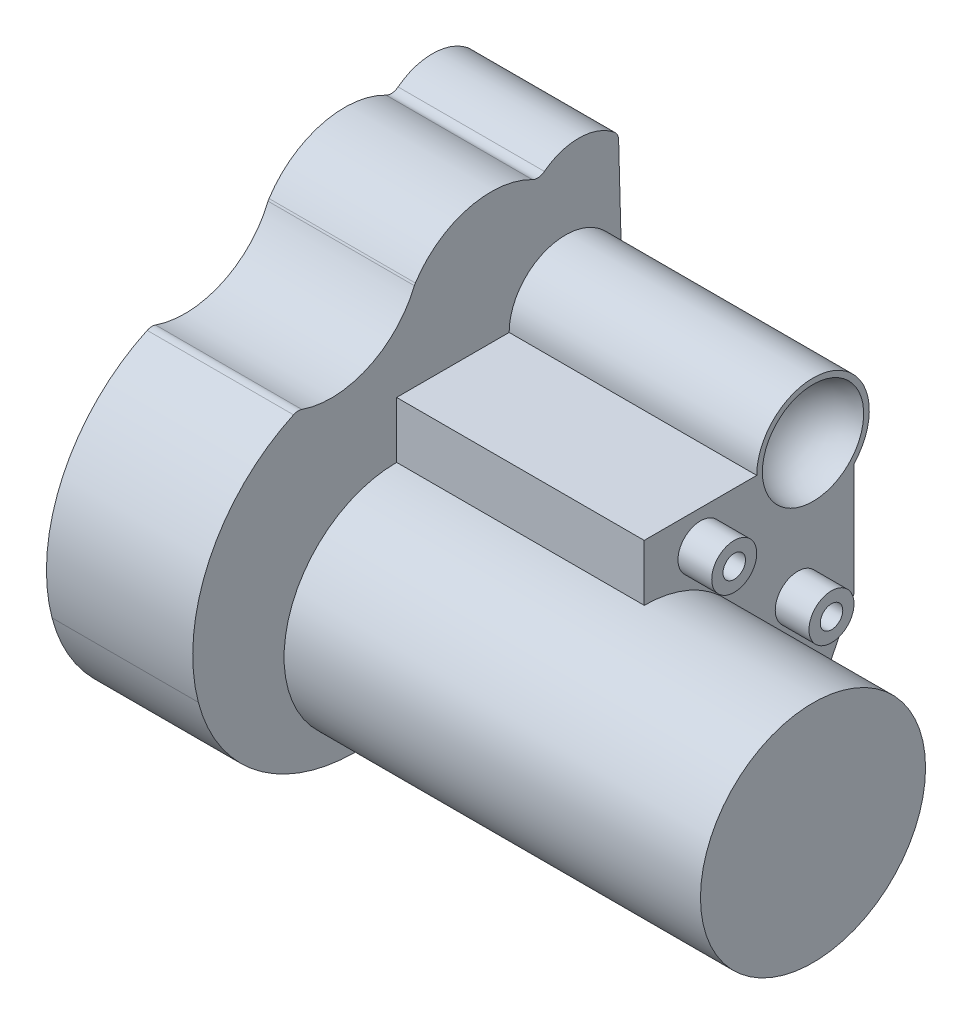
ISO-10303-21;
HEADER;
FILE_DESCRIPTION(('STEP AP214'),'2;1');
FILE_NAME('part.step','',(''),(''),'','','');
FILE_SCHEMA(('AUTOMOTIVE_DESIGN { 1 0 10303 214 1 1 1 1 }'));
ENDSEC;
DATA;
#1=APPLICATION_CONTEXT('core data for automotive mechanical design processes');
#2=APPLICATION_PROTOCOL_DEFINITION('international standard','automotive_design',2000,#1);
#3=PRODUCT_CONTEXT('',#1,'mechanical');
#4=PRODUCT('Part','Part','',(#3));
#5=PRODUCT_RELATED_PRODUCT_CATEGORY('part','',(#4));
#6=PRODUCT_DEFINITION_FORMATION('','',#4);
#7=PRODUCT_DEFINITION_CONTEXT('part definition',#1,'design');
#8=PRODUCT_DEFINITION('design','',#6,#7);
#9=PRODUCT_DEFINITION_SHAPE('','',#8);
#10=(LENGTH_UNIT() NAMED_UNIT(*) SI_UNIT(.MILLI.,.METRE.));
#11=(NAMED_UNIT(*) PLANE_ANGLE_UNIT() SI_UNIT($,.RADIAN.));
#12=(NAMED_UNIT(*) SI_UNIT($,.STERADIAN.) SOLID_ANGLE_UNIT());
#13=UNCERTAINTY_MEASURE_WITH_UNIT(LENGTH_MEASURE(1.E-05),#10,'distance_accuracy_value','');
#14=(GEOMETRIC_REPRESENTATION_CONTEXT(3) GLOBAL_UNCERTAINTY_ASSIGNED_CONTEXT((#13)) GLOBAL_UNIT_ASSIGNED_CONTEXT((#10,
#11,#12)) REPRESENTATION_CONTEXT('',''));
#15=CARTESIAN_POINT('',(0.,0.,0.));
#16=DIRECTION('',(0.,0.,1.));
#17=DIRECTION('',(1.,0.,0.));
#18=AXIS2_PLACEMENT_3D('',#15,#16,#17);
#19=CARTESIAN_POINT('',(-50.,0.,0.));
#20=DIRECTION('',(1.,0.,0.));
#21=DIRECTION('',(0.,0.,-1.));
#22=AXIS2_PLACEMENT_3D('',#19,#20,#21);
#23=CYLINDRICAL_SURFACE('',#22,10.);
#24=CARTESIAN_POINT('',(0.,0.,0.));
#25=DIRECTION('',(1.,0.,0.));
#26=DIRECTION('',(0.,0.,-1.));
#27=AXIS2_PLACEMENT_3D('',#24,#25,#26);
#28=CIRCLE('',#27,10.);
#29=CARTESIAN_POINT('',(0.,0.,-10.));
#30=VERTEX_POINT('',#29);
#31=EDGE_CURVE('E315',#30,#30,#28,.T.);
#32=ORIENTED_EDGE('',*,*,#31,.F.);
#33=EDGE_LOOP('',(#32));
#34=FACE_BOUND('',#33,.T.);
#35=DIRECTION('',(1.,0.,0.));
#36=VECTOR('',#35,1.);
#37=CARTESIAN_POINT('',(-50.,10.,0.));
#38=LINE('',#37,#36);
#39=CARTESIAN_POINT('',(-15.,10.,0.));
#40=VERTEX_POINT('',#39);
#41=CARTESIAN_POINT('',(-37.,10.,0.));
#42=VERTEX_POINT('',#41);
#43=EDGE_CURVE('E319',#40,#42,#38,.F.);
#44=ORIENTED_EDGE('',*,*,#43,.T.);
#45=CARTESIAN_POINT('',(-37.,0.,0.));
#46=DIRECTION('',(-1.,0.,0.));
#47=DIRECTION('',(0.,0.,1.));
#48=AXIS2_PLACEMENT_3D('',#45,#46,#47);
#49=CIRCLE('',#48,10.);
#50=CARTESIAN_POINT('',(-37.,-10.,0.));
#51=VERTEX_POINT('',#50);
#52=EDGE_CURVE('E320',#51,#42,#49,.T.);
#53=ORIENTED_EDGE('',*,*,#52,.F.);
#54=DIRECTION('',(-1.,0.,0.));
#55=VECTOR('',#54,1.);
#56=CARTESIAN_POINT('',(-15.,-10.,0.));
#57=LINE('',#56,#55);
#58=CARTESIAN_POINT('',(-15.,-10.,0.));
#59=VERTEX_POINT('',#58);
#60=EDGE_CURVE('E326',#59,#51,#57,.T.);
#61=ORIENTED_EDGE('',*,*,#60,.F.);
#62=CARTESIAN_POINT('',(-15.,0.,0.));
#63=DIRECTION('',(-1.,0.,0.));
#64=DIRECTION('',(0.,0.,1.));
#65=AXIS2_PLACEMENT_3D('',#62,#63,#64);
#66=CIRCLE('',#65,10.);
#67=CARTESIAN_POINT('',(-15.,-4.7586438353542,-8.79518668637827));
#68=VERTEX_POINT('',#67);
#69=EDGE_CURVE('E335',#59,#68,#66,.F.);
#70=ORIENTED_EDGE('',*,*,#69,.T.);
#71=CARTESIAN_POINT('',(-15.,-4.75864383535178,-8.7951866863726));
#72=CARTESIAN_POINT('',(-14.9558268940209,-4.75864350656766,-8.79518708404648));
#73=CARTESIAN_POINT('',(-14.9116356564466,-4.75574612101029,-8.79675641023494));
#74=CARTESIAN_POINT('',(-14.8241661556282,-4.74410731339931,-8.80303860906836));
#75=CARTESIAN_POINT('',(-14.7808898730519,-4.73535433295313,-8.80775769900793));
#76=CARTESIAN_POINT('',(-14.6962913195909,-4.7118618208952,-8.82034789827312));
#77=CARTESIAN_POINT('',(-14.6549760223784,-4.69710248569725,-8.82822943329732));
#78=CARTESIAN_POINT('',(-14.575829635857,-4.66150214040771,-8.84707875225866));
#79=CARTESIAN_POINT('',(-14.5379934462864,-4.64067022571927,-8.85804191970975));
#80=CARTESIAN_POINT('',(-14.4748449094057,-4.59796230305127,-8.88026978976679));
#81=CARTESIAN_POINT('',(-14.4485709297719,-4.57722365601009,-8.89098798790657));
#82=CARTESIAN_POINT('',(-14.4001803158164,-4.53209501619798,-8.91407627284621));
#83=CARTESIAN_POINT('',(-14.3780623653748,-4.50770618376786,-8.92644583456714));
#84=CARTESIAN_POINT('',(-14.3389186743536,-4.45543285745039,-8.9526519767399));
#85=CARTESIAN_POINT('',(-14.321934646245,-4.42752221072471,-8.96649939886511));
#86=CARTESIAN_POINT('',(-14.2944182546674,-4.36910362228332,-8.99510893589732));
#87=CARTESIAN_POINT('',(-14.283879155866,-4.3385984301413,-9.00987007807992));
#88=CARTESIAN_POINT('',(-14.2710107631572,-4.28043975672838,-9.03762844130118));
#89=CARTESIAN_POINT('',(-14.2677500741415,-4.25297278710381,-9.0505883427895));
#90=CARTESIAN_POINT('',(-14.2668241687123,-4.1978481855485,-9.07628741918052));
#91=CARTESIAN_POINT('',(-14.2691563984039,-4.17019064638831,-9.08902669215318));
#92=CARTESIAN_POINT('',(-14.2788772815525,-4.11766166420888,-9.11293772746178));
#93=CARTESIAN_POINT('',(-14.2858735506432,-4.09273684615446,-9.12415539253821));
#94=CARTESIAN_POINT('',(-14.3041488513327,-4.0441524856089,-9.14579348541309));
#95=CARTESIAN_POINT('',(-14.3154282772818,-4.02049305985134,-9.15621383969697));
#96=CARTESIAN_POINT('',(-14.3423829805957,-3.97386814038485,-9.17654892193133));
#97=CARTESIAN_POINT('',(-14.3582407440293,-3.95098822454152,-9.18641651100526));
#98=CARTESIAN_POINT('',(-14.3934426115413,-3.90756164416255,-9.20497261440431));
#99=CARTESIAN_POINT('',(-14.4127881687952,-3.88701595801308,-9.21366063461167));
#100=CARTESIAN_POINT('',(-14.4571284792549,-3.84590517201177,-9.23090330492731));
#101=CARTESIAN_POINT('',(-14.4825331266788,-3.82570967606245,-9.23928260677338));
#102=CARTESIAN_POINT('',(-14.536176175821,-3.78880699300985,-9.25447677029559));
#103=CARTESIAN_POINT('',(-14.5644161997748,-3.77210181989673,-9.26129072895995));
#104=CARTESIAN_POINT('',(-14.6281442374839,-3.7396323447794,-9.27445469092177));
#105=CARTESIAN_POINT('',(-14.6640361797884,-3.72454330873218,-9.28051523687644));
#106=CARTESIAN_POINT('',(-14.7377737692172,-3.6992753912817,-9.29061601322216));
#107=CARTESIAN_POINT('',(-14.7756205294798,-3.68909934239279,-9.29465507820552));
#108=CARTESIAN_POINT('',(-14.8586402252632,-3.67238593203854,-9.30127289164795));
#109=CARTESIAN_POINT('',(-14.9040125120501,-3.6666969434864,-9.30351232326005));
#110=CARTESIAN_POINT('',(-14.9951804405428,-3.66186683918907,-9.30541437558098));
#111=CARTESIAN_POINT('',(-15.0409763976911,-3.66273107398423,-9.30507489066957));
#112=CARTESIAN_POINT('',(-15.1357980012852,-3.67137999491661,-9.30166623605312));
#113=CARTESIAN_POINT('',(-15.1847635618646,-3.67975218115553,-9.29836532401767));
#114=CARTESIAN_POINT('',(-15.280379034205,-3.70430232339992,-9.2886123505109));
#115=CARTESIAN_POINT('',(-15.3270305476835,-3.72047479471608,-9.2821625031418));
#116=CARTESIAN_POINT('',(-15.4069809196085,-3.75647877288219,-9.26764038923529));
#117=CARTESIAN_POINT('',(-15.4410454654374,-3.77486102975262,-9.26017985845415));
#118=CARTESIAN_POINT('',(-15.5054704281055,-3.81647601332857,-9.2431063875105));
#119=CARTESIAN_POINT('',(-15.5358355636836,-3.83970245626696,-9.23349623462915));
#120=CARTESIAN_POINT('',(-15.5870119736839,-3.8865897942095,-9.21384582286242));
#121=CARTESIAN_POINT('',(-15.608573881303,-3.90956576791005,-9.20412966922469));
#122=CARTESIAN_POINT('',(-15.6472971721671,-3.95840621722519,-9.18323057748568));
#123=CARTESIAN_POINT('',(-15.6644599810526,-3.98426975314075,-9.17204811635916));
#124=CARTESIAN_POINT('',(-15.6935764129903,-4.03848446014547,-9.14830708879385));
#125=CARTESIAN_POINT('',(-15.7054952125867,-4.06685080256862,-9.13573999609742));
#126=CARTESIAN_POINT('',(-15.7231643904435,-4.12501836443434,-9.10962323839953));
#127=CARTESIAN_POINT('',(-15.7289192784182,-4.15481851815163,-9.09607429950759));
#128=CARTESIAN_POINT('',(-15.7335602290888,-4.21121119657511,-9.07009098263221));
#129=CARTESIAN_POINT('',(-15.7331707925429,-4.23777133386224,-9.05771153360055));
#130=CARTESIAN_POINT('',(-15.7272928288401,-4.29031004444083,-9.03294428661083));
#131=CARTESIAN_POINT('',(-15.7218053513422,-4.31628873632118,-9.02055649089595));
#132=CARTESIAN_POINT('',(-15.706316699102,-4.36606995700641,-8.99656448567632));
#133=CARTESIAN_POINT('',(-15.6964733320716,-4.38991627178298,-8.98494793252488));
#134=CARTESIAN_POINT('',(-15.672799286317,-4.4358591608867,-8.96235515213759));
#135=CARTESIAN_POINT('',(-15.6589677173642,-4.45795534315183,-8.95137906852293));
#136=CARTESIAN_POINT('',(-15.6266295723265,-4.50172737990007,-8.9294511470181));
#137=CARTESIAN_POINT('',(-15.607836991965,-4.52322734582993,-8.91857187688621));
#138=CARTESIAN_POINT('',(-15.5669731276429,-4.56350569021496,-8.89802944695476));
#139=CARTESIAN_POINT('',(-15.5449005043056,-4.58228295065948,-8.88836678693882));
#140=CARTESIAN_POINT('',(-15.4945665573651,-4.61964642111244,-8.869012102499));
#141=CARTESIAN_POINT('',(-15.465874846108,-4.63776612750009,-8.85954065238327));
#142=CARTESIAN_POINT('',(-15.4058852401428,-4.67019349561687,-8.84248995585931));
#143=CARTESIAN_POINT('',(-15.3745848691928,-4.68449747995594,-8.83491253525574));
#144=CARTESIAN_POINT('',(-15.3044029603204,-4.71151710192947,-8.8205375213445));
#145=CARTESIAN_POINT('',(-15.2651619881536,-4.72350001930202,-8.81411714793605));
#146=CARTESIAN_POINT('',(-15.1851742903419,-4.74227658565788,-8.80402898794261));
#147=CARTESIAN_POINT('',(-15.1444291453868,-4.74907552823767,-8.80035839349827));
#148=CARTESIAN_POINT('',(-15.0690606726297,-4.75687349800959,-8.79614508590789));
#149=CARTESIAN_POINT('',(-15.0345358778634,-4.7586440924052,-8.79518637545907));
#150=CARTESIAN_POINT('',(-15.,-4.75864383535178,-8.7951866863726));
#151=B_SPLINE_CURVE_WITH_KNOTS('',3,(#71,#72,#73,#74,#75,#76,#77,#78,#79,#80,#81,#82,#83,#84,
#85,#86,#87,#88,#89,#90,#91,#92,#93,#94,#95,#96,#97,#98,#99,#100,#101,#102,#103,#104,#105,#106,
#107,#108,#109,#110,#111,#112,#113,#114,#115,#116,#117,#118,#119,#120,#121,#122,#123,#124,#125,
#126,#127,#128,#129,#130,#131,#132,#133,#134,#135,#136,#137,#138,#139,#140,#141,#142,#143,#144,
#145,#146,#147,#148,#149,#150),.UNSPECIFIED.,.T.,.F.,(4,2,2,2,2,2,2,2,2,2,2,2,2,2,2,2,2,2,2,2,2,
2,2,2,2,2,2,2,2,2,2,2,2,2,2,2,2,2,2,4),(0.,0.132426570558758,0.265115313014988,
0.398245135269075,0.531176573650806,0.636200366249108,0.741190843944197,0.847012745709135,
0.952723867485179,1.04386382677862,1.13496217675032,1.21922758106377,1.30350074557547,
1.39175490891963,1.48004592834338,1.58022071879385,1.68045315355052,1.79821175209846,
1.91603816189304,2.05281367594922,2.18970087575475,2.33833476721941,2.48686430033177,
2.60466464166346,2.72231311504932,2.82082898571128,2.91931288930389,3.01844126367226,
3.11749706291567,3.20497002644944,3.29242498376524,3.37694230818155,3.46147851280326,
3.55279568810177,3.64415025495762,3.74944688259905,3.85484462588068,3.97895242611329,
4.10293332377123,4.2064684446399),.UNSPECIFIED.);
#152=CARTESIAN_POINT('',(-15.,-3.66294903859895,-9.30498814296004));
#153=VERTEX_POINT('',#152);
#154=EDGE_CURVE('E243',#68,#153,#151,.T.);
#155=ORIENTED_EDGE('',*,*,#154,.T.);
#156=EDGE_CURVE('E323',#153,#40,#66,.F.);
#157=ORIENTED_EDGE('',*,*,#156,.T.);
#158=EDGE_LOOP('',(#44,#53,#61,#70,#155,#157));
#159=FACE_BOUND('',#158,.T.);
#160=ADVANCED_FACE('F35',(#34,#159),#23,.T.);
#161=CARTESIAN_POINT('',(-15.,10.,0.));
#162=DIRECTION('',(0.,0.,-1.));
#163=DIRECTION('',(-1.,0.,0.));
#164=AXIS2_PLACEMENT_3D('',#161,#162,#163);
#165=PLANE('',#164);
#166=DIRECTION('',(0.,1.,0.));
#167=VECTOR('',#166,1.);
#168=CARTESIAN_POINT('',(-37.,0.,0.));
#169=LINE('',#168,#167);
#170=CARTESIAN_POINT('',(-37.,15.,0.));
#171=VERTEX_POINT('',#170);
#172=EDGE_CURVE('E409',#42,#171,#169,.T.);
#173=ORIENTED_EDGE('',*,*,#172,.F.);
#174=ORIENTED_EDGE('',*,*,#43,.F.);
#175=DIRECTION('',(0.,1.,0.));
#176=VECTOR('',#175,1.);
#177=CARTESIAN_POINT('',(-15.,10.,0.));
#178=LINE('',#177,#176);
#179=CARTESIAN_POINT('',(-15.,15.,0.));
#180=VERTEX_POINT('',#179);
#181=EDGE_CURVE('E251',#40,#180,#178,.T.);
#182=ORIENTED_EDGE('',*,*,#181,.T.);
#183=DIRECTION('',(-1.,0.,0.));
#184=VECTOR('',#183,1.);
#185=CARTESIAN_POINT('',(-15.,15.,0.));
#186=LINE('',#185,#184);
#187=EDGE_CURVE('E332',#180,#171,#186,.T.);
#188=ORIENTED_EDGE('',*,*,#187,.T.);
#189=EDGE_LOOP('',(#173,#174,#182,#188));
#190=FACE_BOUND('',#189,.T.);
#191=ADVANCED_FACE('F271',(#190),#165,.F.);
#192=CARTESIAN_POINT('',(-15.,15.,-15.));
#193=DIRECTION('',(-1.,0.,0.));
#194=DIRECTION('',(0.,0.,1.));
#195=AXIS2_PLACEMENT_3D('',#192,#193,#194);
#196=CYLINDRICAL_SURFACE('',#195,5.);
#197=CARTESIAN_POINT('',(-50.,15.,-15.));
#198=DIRECTION('',(-1.,0.,0.));
#199=DIRECTION('',(0.,0.,1.));
#200=AXIS2_PLACEMENT_3D('',#197,#198,#199);
#201=CIRCLE('',#200,5.);
#202=CARTESIAN_POINT('',(-50.,15.2742111737005,-19.9924751609014));
#203=VERTEX_POINT('',#202);
#204=CARTESIAN_POINT('',(-50.,11.5749926637884,-18.6427084356144));
#205=VERTEX_POINT('',#204);
#206=EDGE_CURVE('E250',#203,#205,#201,.T.);
#207=ORIENTED_EDGE('',*,*,#206,.F.);
#208=DIRECTION('',(-1.,0.,0.));
#209=VECTOR('',#208,1.);
#210=CARTESIAN_POINT('',(-37.,15.2742111737005,-19.9924751609014));
#211=LINE('',#210,#209);
#212=CARTESIAN_POINT('',(-37.,15.2742111737005,-19.9924751609014));
#213=VERTEX_POINT('',#212);
#214=EDGE_CURVE('E198',#213,#203,#211,.T.);
#215=ORIENTED_EDGE('',*,*,#214,.F.);
#216=CARTESIAN_POINT('',(-37.,15.,-15.));
#217=DIRECTION('',(-1.,0.,0.));
#218=DIRECTION('',(0.,0.,1.));
#219=AXIS2_PLACEMENT_3D('',#216,#217,#218);
#220=CIRCLE('',#219,5.);
#221=CARTESIAN_POINT('',(-37.,15.,-10.));
#222=VERTEX_POINT('',#221);
#223=EDGE_CURVE('E413',#222,#213,#220,.T.);
#224=ORIENTED_EDGE('',*,*,#223,.F.);
#225=DIRECTION('',(-1.,0.,0.));
#226=VECTOR('',#225,1.);
#227=CARTESIAN_POINT('',(-15.,15.,-10.));
#228=LINE('',#227,#226);
#229=CARTESIAN_POINT('',(-15.,15.,-10.));
#230=VERTEX_POINT('',#229);
#231=EDGE_CURVE('E456',#230,#222,#228,.T.);
#232=ORIENTED_EDGE('',*,*,#231,.F.);
#233=CARTESIAN_POINT('',(-15.,15.,-15.));
#234=DIRECTION('',(-1.,0.,0.));
#235=DIRECTION('',(0.,0.,1.));
#236=AXIS2_PLACEMENT_3D('',#233,#234,#235);
#237=CIRCLE('',#236,5.);
#238=CARTESIAN_POINT('',(-15.,11.5749926637884,-18.6427084356144));
#239=VERTEX_POINT('',#238);
#240=EDGE_CURVE('E497',#230,#239,#237,.T.);
#241=ORIENTED_EDGE('',*,*,#240,.T.);
#242=DIRECTION('',(-1.,0.,0.));
#243=VECTOR('',#242,1.);
#244=CARTESIAN_POINT('',(-15.,11.5749926637884,-18.6427084356144));
#245=LINE('',#244,#243);
#246=EDGE_CURVE('E459',#239,#205,#245,.T.);
#247=ORIENTED_EDGE('',*,*,#246,.T.);
#248=EDGE_LOOP('',(#207,#215,#224,#232,#241,#247));
#249=FACE_BOUND('',#248,.T.);
#250=ADVANCED_FACE('F274',(#249),#196,.T.);
#251=CARTESIAN_POINT('',(-15.,15.,0.));
#252=DIRECTION('',(0.,1.,0.));
#253=DIRECTION('',(0.,0.,1.));
#254=AXIS2_PLACEMENT_3D('',#251,#252,#253);
#255=PLANE('',#254);
#256=ORIENTED_EDGE('',*,*,#231,.T.);
#257=DIRECTION('',(0.,0.,-1.));
#258=VECTOR('',#257,1.);
#259=CARTESIAN_POINT('',(-37.,15.,0.));
#260=LINE('',#259,#258);
#261=EDGE_CURVE('E411',#171,#222,#260,.T.);
#262=ORIENTED_EDGE('',*,*,#261,.F.);
#263=ORIENTED_EDGE('',*,*,#187,.F.);
#264=DIRECTION('',(0.,0.,-1.));
#265=VECTOR('',#264,1.);
#266=CARTESIAN_POINT('',(-15.,15.,0.));
#267=LINE('',#266,#265);
#268=EDGE_CURVE('E520',#180,#230,#267,.T.);
#269=ORIENTED_EDGE('',*,*,#268,.T.);
#270=EDGE_LOOP('',(#256,#262,#263,#269));
#271=FACE_BOUND('',#270,.T.);
#272=ADVANCED_FACE('F298',(#271),#255,.T.);
#273=CARTESIAN_POINT('',(-15.,15.,-15.));
#274=DIRECTION('',(-1.,0.,0.));
#275=DIRECTION('',(0.,0.,1.));
#276=AXIS2_PLACEMENT_3D('',#273,#274,#275);
#277=PLANE('',#276);
#278=CARTESIAN_POINT('',(-15.,12.,-5.));
#279=DIRECTION('',(-1.,0.,0.));
#280=DIRECTION('',(0.,0.,1.));
#281=AXIS2_PLACEMENT_3D('',#278,#279,#280);
#282=CIRCLE('',#281,2.);
#283=CARTESIAN_POINT('',(-15.,12.,-3.));
#284=VERTEX_POINT('',#283);
#285=EDGE_CURVE('E346',#284,#284,#282,.F.);
#286=ORIENTED_EDGE('',*,*,#285,.F.);
#287=EDGE_LOOP('',(#286));
#288=FACE_BOUND('',#287,.T.);
#289=CARTESIAN_POINT('',(-15.,3.80169288123777,-13.6427084356144));
#290=DIRECTION('',(-1.,0.,0.));
#291=DIRECTION('',(0.,0.,1.));
#292=AXIS2_PLACEMENT_3D('',#289,#290,#291);
#293=CIRCLE('',#292,2.);
#294=CARTESIAN_POINT('',(-15.,3.80169288123777,-11.6427084356144));
#295=VERTEX_POINT('',#294);
#296=EDGE_CURVE('E343',#295,#295,#293,.F.);
#297=ORIENTED_EDGE('',*,*,#296,.F.);
#298=EDGE_LOOP('',(#297));
#299=FACE_BOUND('',#298,.T.);
#300=CARTESIAN_POINT('',(-15.,15.,-15.));
#301=DIRECTION('',(-1.,0.,0.));
#302=DIRECTION('',(0.,0.,1.));
#303=AXIS2_PLACEMENT_3D('',#300,#301,#302);
#304=CIRCLE('',#303,4.5);
#305=CARTESIAN_POINT('',(-15.,15.,-10.5));
#306=VERTEX_POINT('',#305);
#307=EDGE_CURVE('E239',#306,#306,#304,.T.);
#308=ORIENTED_EDGE('',*,*,#307,.T.);
#309=EDGE_LOOP('',(#308));
#310=FACE_BOUND('',#309,.T.);
#311=CARTESIAN_POINT('',(-15.,-6.19830711876223,-13.321760405032));
#312=DIRECTION('',(-1.,0.,0.));
#313=DIRECTION('',(0.,0.,1.));
#314=AXIS2_PLACEMENT_3D('',#311,#312,#313);
#315=CIRCLE('',#314,4.75);
#316=CARTESIAN_POINT('',(-15.,-2.80216163039296,-16.6427084356144));
#317=VERTEX_POINT('',#316);
#318=EDGE_CURVE('E340',#317,#153,#315,.F.);
#319=ORIENTED_EDGE('',*,*,#318,.F.);
#320=DIRECTION('',(0.,-1.,0.));
#321=VECTOR('',#320,1.);
#322=CARTESIAN_POINT('',(-15.,-2.42500733621165,-16.6427084356144));
#323=LINE('',#322,#321);
#324=CARTESIAN_POINT('',(-15.,-2.42500733621165,-16.6427084356144));
#325=VERTEX_POINT('',#324);
#326=EDGE_CURVE('E466',#325,#317,#323,.T.);
#327=ORIENTED_EDGE('',*,*,#326,.F.);
#328=DIRECTION('',(0.,-0.894427190999916,0.447213595499958));
#329=VECTOR('',#328,1.);
#330=CARTESIAN_POINT('',(-15.,1.57499266378835,-18.6427084356144));
#331=LINE('',#330,#329);
#332=CARTESIAN_POINT('',(-15.,1.57499266378835,-18.6427084356144));
#333=VERTEX_POINT('',#332);
#334=EDGE_CURVE('E505',#333,#325,#331,.T.);
#335=ORIENTED_EDGE('',*,*,#334,.F.);
#336=DIRECTION('',(0.,-1.,0.));
#337=VECTOR('',#336,1.);
#338=CARTESIAN_POINT('',(-15.,11.5749926637884,-18.6427084356144));
#339=LINE('',#338,#337);
#340=EDGE_CURVE('E518',#239,#333,#339,.T.);
#341=ORIENTED_EDGE('',*,*,#340,.F.);
#342=ORIENTED_EDGE('',*,*,#240,.F.);
#343=ORIENTED_EDGE('',*,*,#268,.F.);
#344=ORIENTED_EDGE('',*,*,#181,.F.);
#345=ORIENTED_EDGE('',*,*,#156,.F.);
#346=EDGE_LOOP('',(#319,#327,#335,#341,#342,#343,#344,#345));
#347=FACE_BOUND('',#346,.T.);
#348=ADVANCED_FACE('F270',(#288,#299,#310,#347),#277,.F.);
#349=CARTESIAN_POINT('',(-50.,0.,0.));
#350=DIRECTION('',(1.,0.,0.));
#351=DIRECTION('',(0.,0.,-1.));
#352=AXIS2_PLACEMENT_3D('',#349,#350,#351);
#353=PLANE('',#352);
#354=DIRECTION('',(0.,0.999623687239425,0.027431440171024));
#355=VECTOR('',#354,1.);
#356=CARTESIAN_POINT('',(-50.,0.559709606048781,-20.3962670823536));
#357=LINE('',#356,#355);
#358=CARTESIAN_POINT('',(-50.,24.6233101378481,-19.7359193667943));
#359=VERTEX_POINT('',#358);
#360=CARTESIAN_POINT('',(-50.,24.9757959168408,-19.7262465342264));
#361=VERTEX_POINT('',#360);
#362=EDGE_CURVE('E193',#359,#361,#357,.T.);
#363=ORIENTED_EDGE('',*,*,#362,.F.);
#364=CARTESIAN_POINT('',(-50.,20.1250035452707,-19.8593608475639));
#365=DIRECTION('',(1.,0.,0.));
#366=DIRECTION('',(0.,0.,-1.));
#367=AXIS2_PLACEMENT_3D('',#364,#365,#366);
#368=CIRCLE('',#367,4.5);
#369=CARTESIAN_POINT('',(-50.,15.6266969526933,-19.9828023283335));
#370=VERTEX_POINT('',#369);
#371=EDGE_CURVE('E49',#359,#370,#368,.T.);
#372=ORIENTED_EDGE('',*,*,#371,.T.);
#373=EDGE_CURVE('E190',#203,#370,#357,.T.);
#374=ORIENTED_EDGE('',*,*,#373,.F.);
#375=ORIENTED_EDGE('',*,*,#206,.T.);
#376=DIRECTION('',(0.,-1.,0.));
#377=VECTOR('',#376,1.);
#378=CARTESIAN_POINT('',(-50.,11.5749926637884,-18.6427084356144));
#379=LINE('',#378,#377);
#380=CARTESIAN_POINT('',(-50.,1.57499266378835,-18.6427084356144));
#381=VERTEX_POINT('',#380);
#382=EDGE_CURVE('E471',#205,#381,#379,.T.);
#383=ORIENTED_EDGE('',*,*,#382,.T.);
#384=DIRECTION('',(0.,-0.894427190999916,0.447213595499958));
#385=VECTOR('',#384,1.);
#386=CARTESIAN_POINT('',(-50.,1.57499266378835,-18.6427084356144));
#387=LINE('',#386,#385);
#388=CARTESIAN_POINT('',(-50.,-2.42500733621165,-16.6427084356144));
#389=VERTEX_POINT('',#388);
#390=EDGE_CURVE('E474',#381,#389,#387,.T.);
#391=ORIENTED_EDGE('',*,*,#390,.T.);
#392=DIRECTION('',(0.,-1.,0.));
#393=VECTOR('',#392,1.);
#394=CARTESIAN_POINT('',(-50.,-2.42500733621165,-16.6427084356144));
#395=LINE('',#394,#393);
#396=CARTESIAN_POINT('',(-50.,-9.99775044892711,-16.6427084356144));
#397=VERTEX_POINT('',#396);
#398=EDGE_CURVE('E477',#389,#397,#395,.T.);
#399=ORIENTED_EDGE('',*,*,#398,.T.);
#400=CARTESIAN_POINT('',(-50.,-6.,-13.32));
#401=DIRECTION('',(1.,0.,0.));
#402=DIRECTION('',(0.,0.,-1.));
#403=AXIS2_PLACEMENT_3D('',#400,#401,#402);
#404=CIRCLE('',#403,5.19830741684252);
#405=CARTESIAN_POINT('',(-50.,-10.,-10.));
#406=VERTEX_POINT('',#405);
#407=EDGE_CURVE('E480',#406,#397,#404,.T.);
#408=ORIENTED_EDGE('',*,*,#407,.F.);
#409=DIRECTION('',(0.,0.,-1.));
#410=VECTOR('',#409,1.);
#411=CARTESIAN_POINT('',(-50.,-10.,0.));
#412=LINE('',#411,#410);
#413=CARTESIAN_POINT('',(-50.,-10.,0.));
#414=VERTEX_POINT('',#413);
#415=EDGE_CURVE('E483',#414,#406,#412,.T.);
#416=ORIENTED_EDGE('',*,*,#415,.F.);
#417=CARTESIAN_POINT('',(-50.,3.98195125951587,3.63689802684925));
#418=DIRECTION('',(-1.,0.,0.));
#419=DIRECTION('',(0.,0.,1.));
#420=AXIS2_PLACEMENT_3D('',#417,#418,#419);
#421=CIRCLE('',#420,14.4472138587749);
#422=CARTESIAN_POINT('',(-50.,0.345053232664054,17.6188492863645));
#423=VERTEX_POINT('',#422);
#424=EDGE_CURVE('E199',#414,#423,#421,.T.);
#425=ORIENTED_EDGE('',*,*,#424,.T.);
#426=CARTESIAN_POINT('',(-50.,4.23247986290294,2.67374792040959));
#427=DIRECTION('',(-1.,0.,0.));
#428=DIRECTION('',(0.,0.,1.));
#429=AXIS2_PLACEMENT_3D('',#426,#427,#428);
#430=CIRCLE('',#429,15.4424136923007);
#431=CARTESIAN_POINT('',(-50.,18.2444597450297,9.16470782068875));
#432=VERTEX_POINT('',#431);
#433=EDGE_CURVE('E202',#423,#432,#430,.T.);
#434=ORIENTED_EDGE('',*,*,#433,.T.);
#435=CARTESIAN_POINT('',(-50.,17.3370899412332,8.74437457294553));
#436=DIRECTION('',(1.,0.,0.));
#437=DIRECTION('',(0.,0.,-1.));
#438=AXIS2_PLACEMENT_3D('',#435,#436,#437);
#439=CIRCLE('',#438,1.);
#440=CARTESIAN_POINT('',(-50.,18.28286013423,8.419538087866));
#441=VERTEX_POINT('',#440);
#442=EDGE_CURVE('E354',#432,#441,#439,.F.);
#443=ORIENTED_EDGE('',*,*,#442,.T.);
#444=CARTESIAN_POINT('',(-50.,25.8490216782043,5.82084620722977));
#445=DIRECTION('',(-1.,0.,0.));
#446=DIRECTION('',(0.,0.,1.));
#447=AXIS2_PLACEMENT_3D('',#444,#445,#446);
#448=CIRCLE('',#447,8.);
#449=CARTESIAN_POINT('',(-50.,22.8097131556067,-1.57932971665649));
#450=VERTEX_POINT('',#449);
#451=EDGE_CURVE('E210',#441,#450,#448,.F.);
#452=ORIENTED_EDGE('',*,*,#451,.T.);
#453=CARTESIAN_POINT('',(-50.,22.429799590282,-2.50435170714227));
#454=DIRECTION('',(1.,0.,0.));
#455=DIRECTION('',(0.,0.,-1.));
#456=AXIS2_PLACEMENT_3D('',#453,#454,#455);
#457=CIRCLE('',#456,1.);
#458=CARTESIAN_POINT('',(-50.,22.9727489897229,-1.66458629368042));
#459=VERTEX_POINT('',#458);
#460=EDGE_CURVE('E352',#450,#459,#457,.F.);
#461=ORIENTED_EDGE('',*,*,#460,.T.);
#462=CARTESIAN_POINT('',(-50.,18.6291537941956,-8.38270960137518));
#463=DIRECTION('',(-1.,0.,0.));
#464=DIRECTION('',(0.,0.,1.));
#465=AXIS2_PLACEMENT_3D('',#462,#463,#464);
#466=CIRCLE('',#465,8.);
#467=CARTESIAN_POINT('',(-50.,25.7329790040555,-12.0617947305559));
#468=VERTEX_POINT('',#467);
#469=EDGE_CURVE('E194',#459,#468,#466,.T.);
#470=ORIENTED_EDGE('',*,*,#469,.T.);
#471=CARTESIAN_POINT('',(-50.,26.6209571552879,-12.5216803717035));
#472=DIRECTION('',(1.,0.,0.));
#473=DIRECTION('',(0.,0.,-1.));
#474=AXIS2_PLACEMENT_3D('',#471,#472,#473);
#475=CIRCLE('',#474,1.);
#476=CARTESIAN_POINT('',(-50.,25.828220976215,-13.1312452578222));
#477=VERTEX_POINT('',#476);
#478=EDGE_CURVE('E372',#468,#477,#475,.T.);
#479=ORIENTED_EDGE('',*,*,#478,.T.);
#480=CARTESIAN_POINT('',(-50.,21.8645400808503,-16.1790696884154));
#481=DIRECTION('',(-1.,0.,0.));
#482=DIRECTION('',(0.,0.,1.));
#483=AXIS2_PLACEMENT_3D('',#480,#481,#482);
#484=CIRCLE('',#483,5.);
#485=CARTESIAN_POINT('',(-50.,25.7193205756247,-19.3635111366299));
#486=VERTEX_POINT('',#485);
#487=EDGE_CURVE('E204',#477,#486,#484,.T.);
#488=ORIENTED_EDGE('',*,*,#487,.T.);
#489=CARTESIAN_POINT('',(-50.,24.9483644766698,-18.726622846987));
#490=DIRECTION('',(1.,0.,0.));
#491=DIRECTION('',(0.,0.,-1.));
#492=AXIS2_PLACEMENT_3D('',#489,#490,#491);
#493=CIRCLE('',#492,1.);
#494=EDGE_CURVE('E379',#486,#361,#493,.F.);
#495=ORIENTED_EDGE('',*,*,#494,.T.);
#496=EDGE_LOOP('',(#363,#372,#374,#375,#383,#391,#399,#408,#416,#425,#434,#443,#452,#461,#470,
#479,#488,#495));
#497=FACE_BOUND('',#496,.T.);
#498=ADVANCED_FACE('F189',(#497),#353,.F.);
#499=CARTESIAN_POINT('',(0.,0.,0.));
#500=DIRECTION('',(1.,0.,0.));
#501=DIRECTION('',(0.,0.,-1.));
#502=AXIS2_PLACEMENT_3D('',#499,#500,#501);
#503=PLANE('',#502);
#504=ORIENTED_EDGE('',*,*,#31,.T.);
#505=EDGE_LOOP('',(#504));
#506=FACE_BOUND('',#505,.T.);
#507=ADVANCED_FACE('F280',(#506),#503,.T.);
#508=CARTESIAN_POINT('',(-15.,-10.,0.));
#509=DIRECTION('',(0.,1.,0.));
#510=DIRECTION('',(0.,0.,1.));
#511=AXIS2_PLACEMENT_3D('',#508,#509,#510);
#512=PLANE('',#511);
#513=ORIENTED_EDGE('',*,*,#415,.T.);
#514=DIRECTION('',(-1.,0.,0.));
#515=VECTOR('',#514,1.);
#516=CARTESIAN_POINT('',(-15.,-10.,-10.));
#517=LINE('',#516,#515);
#518=CARTESIAN_POINT('',(-15.,-10.,-10.));
#519=VERTEX_POINT('',#518);
#520=EDGE_CURVE('E329',#519,#406,#517,.T.);
#521=ORIENTED_EDGE('',*,*,#520,.F.);
#522=DIRECTION('',(0.,0.,-1.));
#523=VECTOR('',#522,1.);
#524=CARTESIAN_POINT('',(-15.,-10.,0.));
#525=LINE('',#524,#523);
#526=EDGE_CURVE('E457',#59,#519,#525,.T.);
#527=ORIENTED_EDGE('',*,*,#526,.F.);
#528=ORIENTED_EDGE('',*,*,#60,.T.);
#529=DIRECTION('',(-1.,0.,0.));
#530=VECTOR('',#529,1.);
#531=CARTESIAN_POINT('',(-37.,-10.,0.));
#532=LINE('',#531,#530);
#533=EDGE_CURVE('E217',#51,#414,#532,.T.);
#534=ORIENTED_EDGE('',*,*,#533,.T.);
#535=EDGE_LOOP('',(#513,#521,#527,#528,#534));
#536=FACE_BOUND('',#535,.T.);
#537=ADVANCED_FACE('F276',(#536),#512,.F.);
#538=CARTESIAN_POINT('',(-15.,-6.,-13.32));
#539=DIRECTION('',(-1.,0.,0.));
#540=DIRECTION('',(0.,0.,1.));
#541=AXIS2_PLACEMENT_3D('',#538,#539,#540);
#542=CYLINDRICAL_SURFACE('',#541,5.19830741684252);
#543=ORIENTED_EDGE('',*,*,#407,.T.);
#544=DIRECTION('',(-1.,0.,0.));
#545=VECTOR('',#544,1.);
#546=CARTESIAN_POINT('',(-15.,-9.99775044892711,-16.6427084356144));
#547=LINE('',#546,#545);
#548=CARTESIAN_POINT('',(-15.,-9.99775044892711,-16.6427084356144));
#549=VERTEX_POINT('',#548);
#550=EDGE_CURVE('E487',#549,#397,#547,.T.);
#551=ORIENTED_EDGE('',*,*,#550,.F.);
#552=CARTESIAN_POINT('',(-15.,-6.,-13.32));
#553=DIRECTION('',(1.,0.,0.));
#554=DIRECTION('',(0.,0.,-1.));
#555=AXIS2_PLACEMENT_3D('',#552,#553,#554);
#556=CIRCLE('',#555,5.19830741684252);
#557=EDGE_CURVE('E460',#519,#549,#556,.T.);
#558=ORIENTED_EDGE('',*,*,#557,.F.);
#559=ORIENTED_EDGE('',*,*,#520,.T.);
#560=EDGE_LOOP('',(#543,#551,#558,#559));
#561=FACE_BOUND('',#560,.T.);
#562=ADVANCED_FACE('F279',(#561),#542,.T.);
#563=CARTESIAN_POINT('',(-15.,-2.42500733621165,-16.6427084356144));
#564=DIRECTION('',(0.,0.,-1.));
#565=DIRECTION('',(-1.,0.,0.));
#566=AXIS2_PLACEMENT_3D('',#563,#564,#565);
#567=PLANE('',#566);
#568=ORIENTED_EDGE('',*,*,#326,.T.);
#569=CARTESIAN_POINT('',(-15.,-6.19830711876223,-16.6427084356144));
#570=DIRECTION('',(0.,0.,-1.));
#571=DIRECTION('',(-1.,0.,0.));
#572=AXIS2_PLACEMENT_3D('',#569,#570,#571);
#573=CIRCLE('',#572,3.39614548836927);
#574=CARTESIAN_POINT('',(-15.,-9.5944526071315,-16.6427084356144));
#575=VERTEX_POINT('',#574);
#576=EDGE_CURVE('E240',#317,#575,#573,.F.);
#577=ORIENTED_EDGE('',*,*,#576,.T.);
#578=EDGE_CURVE('E510',#575,#549,#323,.T.);
#579=ORIENTED_EDGE('',*,*,#578,.T.);
#580=ORIENTED_EDGE('',*,*,#550,.T.);
#581=ORIENTED_EDGE('',*,*,#398,.F.);
#582=DIRECTION('',(-1.,0.,0.));
#583=VECTOR('',#582,1.);
#584=CARTESIAN_POINT('',(-15.,-2.42500733621165,-16.6427084356144));
#585=LINE('',#584,#583);
#586=EDGE_CURVE('E489',#325,#389,#585,.T.);
#587=ORIENTED_EDGE('',*,*,#586,.F.);
#588=EDGE_LOOP('',(#568,#577,#579,#580,#581,#587));
#589=FACE_BOUND('',#588,.T.);
#590=ADVANCED_FACE('F284',(#589),#567,.T.);
#591=CARTESIAN_POINT('',(-15.,1.57499266378835,-18.6427084356144));
#592=DIRECTION('',(0.,-0.447213595499958,-0.894427190999916));
#593=DIRECTION('',(0.,0.894427190999916,-0.447213595499958));
#594=AXIS2_PLACEMENT_3D('',#591,#592,#593);
#595=PLANE('',#594);
#596=ORIENTED_EDGE('',*,*,#390,.F.);
#597=DIRECTION('',(-1.,0.,0.));
#598=VECTOR('',#597,1.);
#599=CARTESIAN_POINT('',(-15.,1.57499266378835,-18.6427084356144));
#600=LINE('',#599,#598);
#601=EDGE_CURVE('E491',#333,#381,#600,.T.);
#602=ORIENTED_EDGE('',*,*,#601,.F.);
#603=ORIENTED_EDGE('',*,*,#334,.T.);
#604=ORIENTED_EDGE('',*,*,#586,.T.);
#605=EDGE_LOOP('',(#596,#602,#603,#604));
#606=FACE_BOUND('',#605,.T.);
#607=ADVANCED_FACE('F288',(#606),#595,.T.);
#608=CARTESIAN_POINT('',(-15.,11.5749926637884,-18.6427084356144));
#609=DIRECTION('',(0.,0.,-1.));
#610=DIRECTION('',(-1.,0.,0.));
#611=AXIS2_PLACEMENT_3D('',#608,#609,#610);
#612=PLANE('',#611);
#613=ORIENTED_EDGE('',*,*,#382,.F.);
#614=ORIENTED_EDGE('',*,*,#246,.F.);
#615=ORIENTED_EDGE('',*,*,#340,.T.);
#616=ORIENTED_EDGE('',*,*,#601,.T.);
#617=EDGE_LOOP('',(#613,#614,#615,#616));
#618=FACE_BOUND('',#617,.T.);
#619=ADVANCED_FACE('F267',(#618),#612,.T.);
#620=EDGE_CURVE('E338',#68,#575,#315,.F.);
#621=ORIENTED_EDGE('',*,*,#620,.F.);
#622=ORIENTED_EDGE('',*,*,#69,.F.);
#623=ORIENTED_EDGE('',*,*,#526,.T.);
#624=ORIENTED_EDGE('',*,*,#557,.T.);
#625=ORIENTED_EDGE('',*,*,#578,.F.);
#626=EDGE_LOOP('',(#621,#622,#623,#624,#625));
#627=FACE_BOUND('',#626,.T.);
#628=ADVANCED_FACE('F262',(#627),#277,.F.);
#629=CARTESIAN_POINT('',(-15.,-6.19830711876223,-13.321760405032));
#630=DIRECTION('',(0.,1.,0.));
#631=DIRECTION('',(0.,0.,-1.));
#632=AXIS2_PLACEMENT_3D('',#629,#630,#631);
#633=SPHERICAL_SURFACE('',#632,4.75);
#634=ORIENTED_EDGE('',*,*,#318,.T.);
#635=ORIENTED_EDGE('',*,*,#154,.F.);
#636=ORIENTED_EDGE('',*,*,#620,.T.);
#637=ORIENTED_EDGE('',*,*,#576,.F.);
#638=EDGE_LOOP('',(#634,#635,#636,#637));
#639=FACE_BOUND('',#638,.T.);
#640=ADVANCED_FACE('F256',(#639),#633,.F.);
#641=CARTESIAN_POINT('',(-15.,15.,-15.));
#642=DIRECTION('',(0.,-1.,0.));
#643=DIRECTION('',(0.,0.,1.));
#644=AXIS2_PLACEMENT_3D('',#641,#642,#643);
#645=SPHERICAL_SURFACE('',#644,4.5);
#646=CARTESIAN_POINT('',(-15.,15.,-15.));
#647=DIRECTION('',(-1.,0.,0.));
#648=DIRECTION('',(0.,0.,1.));
#649=AXIS2_PLACEMENT_3D('',#646,#647,#648);
#650=SPHERICAL_SURFACE('',#649,4.5);
#651=ORIENTED_EDGE('',*,*,#307,.F.);
#652=EDGE_LOOP('',(#651));
#653=FACE_BOUND('',#652,.T.);
#654=ADVANCED_FACE('F261',(#653),#650,.F.);
#655=CARTESIAN_POINT('',(-12.,3.80169288123777,-13.6427084356144));
#656=DIRECTION('',(1.,0.,0.));
#657=DIRECTION('',(0.,0.,-1.));
#658=AXIS2_PLACEMENT_3D('',#655,#656,#657);
#659=PLANE('',#658);
#660=CARTESIAN_POINT('',(-12.,3.80169288123777,-13.6427084356144));
#661=DIRECTION('',(1.,0.,0.));
#662=DIRECTION('',(0.,0.,-1.));
#663=AXIS2_PLACEMENT_3D('',#660,#661,#662);
#664=CIRCLE('',#663,2.);
#665=CARTESIAN_POINT('',(-12.,3.80169288123777,-15.6427084356144));
#666=VERTEX_POINT('',#665);
#667=EDGE_CURVE('E234',#666,#666,#664,.T.);
#668=ORIENTED_EDGE('',*,*,#667,.T.);
#669=EDGE_LOOP('',(#668));
#670=FACE_BOUND('',#669,.T.);
#671=CARTESIAN_POINT('',(-12.,3.80169288123777,-13.6427084356144));
#672=DIRECTION('',(1.,0.,0.));
#673=DIRECTION('',(0.,0.,-1.));
#674=AXIS2_PLACEMENT_3D('',#671,#672,#673);
#675=CIRCLE('',#674,1.);
#676=CARTESIAN_POINT('',(-12.,3.80169288123777,-14.6427084356144));
#677=VERTEX_POINT('',#676);
#678=EDGE_CURVE('E231',#677,#677,#675,.T.);
#679=ORIENTED_EDGE('',*,*,#678,.F.);
#680=EDGE_LOOP('',(#679));
#681=FACE_BOUND('',#680,.T.);
#682=ADVANCED_FACE('F562',(#670,#681),#659,.T.);
#683=CARTESIAN_POINT('',(-12.,3.80169288123777,-13.6427084356144));
#684=DIRECTION('',(-1.,0.,0.));
#685=DIRECTION('',(0.,0.,1.));
#686=AXIS2_PLACEMENT_3D('',#683,#684,#685);
#687=CYLINDRICAL_SURFACE('',#686,2.);
#688=ORIENTED_EDGE('',*,*,#667,.F.);
#689=EDGE_LOOP('',(#688));
#690=FACE_BOUND('',#689,.T.);
#691=ORIENTED_EDGE('',*,*,#296,.T.);
#692=EDGE_LOOP('',(#691));
#693=FACE_BOUND('',#692,.T.);
#694=ADVANCED_FACE('F539',(#690,#693),#687,.T.);
#695=CARTESIAN_POINT('',(-12.,3.80169288123777,-13.6427084356144));
#696=DIRECTION('',(-1.,0.,0.));
#697=DIRECTION('',(0.,0.,1.));
#698=AXIS2_PLACEMENT_3D('',#695,#696,#697);
#699=CYLINDRICAL_SURFACE('',#698,1.);
#700=ORIENTED_EDGE('',*,*,#678,.T.);
#701=EDGE_LOOP('',(#700));
#702=FACE_BOUND('',#701,.T.);
#703=CARTESIAN_POINT('',(-15.,3.80169288123777,-13.6427084356144));
#704=DIRECTION('',(1.,0.,0.));
#705=DIRECTION('',(0.,0.,-1.));
#706=AXIS2_PLACEMENT_3D('',#703,#704,#705);
#707=CIRCLE('',#706,1.);
#708=CARTESIAN_POINT('',(-15.,3.80169288123777,-14.6427084356144));
#709=VERTEX_POINT('',#708);
#710=EDGE_CURVE('E230',#709,#709,#707,.T.);
#711=ORIENTED_EDGE('',*,*,#710,.F.);
#712=EDGE_LOOP('',(#711));
#713=FACE_BOUND('',#712,.T.);
#714=ADVANCED_FACE('F530',(#702,#713),#699,.F.);
#715=ORIENTED_EDGE('',*,*,#710,.T.);
#716=EDGE_LOOP('',(#715));
#717=FACE_BOUND('',#716,.T.);
#718=ADVANCED_FACE('F523',(#717),#277,.F.);
#719=CARTESIAN_POINT('',(-12.,12.,-5.));
#720=DIRECTION('',(1.,0.,0.));
#721=DIRECTION('',(0.,0.,-1.));
#722=AXIS2_PLACEMENT_3D('',#719,#720,#721);
#723=PLANE('',#722);
#724=CARTESIAN_POINT('',(-12.,12.,-5.));
#725=DIRECTION('',(1.,0.,0.));
#726=DIRECTION('',(0.,0.,-1.));
#727=AXIS2_PLACEMENT_3D('',#724,#725,#726);
#728=CIRCLE('',#727,2.);
#729=CARTESIAN_POINT('',(-12.,12.,-7.));
#730=VERTEX_POINT('',#729);
#731=EDGE_CURVE('E225',#730,#730,#728,.T.);
#732=ORIENTED_EDGE('',*,*,#731,.T.);
#733=EDGE_LOOP('',(#732));
#734=FACE_BOUND('',#733,.T.);
#735=CARTESIAN_POINT('',(-12.,12.,-5.));
#736=DIRECTION('',(1.,0.,0.));
#737=DIRECTION('',(0.,0.,-1.));
#738=AXIS2_PLACEMENT_3D('',#735,#736,#737);
#739=CIRCLE('',#738,1.);
#740=CARTESIAN_POINT('',(-12.,12.,-6.));
#741=VERTEX_POINT('',#740);
#742=EDGE_CURVE('E222',#741,#741,#739,.T.);
#743=ORIENTED_EDGE('',*,*,#742,.F.);
#744=EDGE_LOOP('',(#743));
#745=FACE_BOUND('',#744,.T.);
#746=ADVANCED_FACE('F529',(#734,#745),#723,.T.);
#747=CARTESIAN_POINT('',(-12.,12.,-5.));
#748=DIRECTION('',(-1.,0.,0.));
#749=DIRECTION('',(0.,0.,1.));
#750=AXIS2_PLACEMENT_3D('',#747,#748,#749);
#751=CYLINDRICAL_SURFACE('',#750,2.);
#752=ORIENTED_EDGE('',*,*,#731,.F.);
#753=EDGE_LOOP('',(#752));
#754=FACE_BOUND('',#753,.T.);
#755=ORIENTED_EDGE('',*,*,#285,.T.);
#756=EDGE_LOOP('',(#755));
#757=FACE_BOUND('',#756,.T.);
#758=ADVANCED_FACE('F536',(#754,#757),#751,.T.);
#759=CARTESIAN_POINT('',(-12.,12.,-5.));
#760=DIRECTION('',(-1.,0.,0.));
#761=DIRECTION('',(0.,0.,1.));
#762=AXIS2_PLACEMENT_3D('',#759,#760,#761);
#763=CYLINDRICAL_SURFACE('',#762,1.);
#764=ORIENTED_EDGE('',*,*,#742,.T.);
#765=EDGE_LOOP('',(#764));
#766=FACE_BOUND('',#765,.T.);
#767=CARTESIAN_POINT('',(-15.,12.,-5.));
#768=DIRECTION('',(1.,0.,0.));
#769=DIRECTION('',(0.,0.,-1.));
#770=AXIS2_PLACEMENT_3D('',#767,#768,#769);
#771=CIRCLE('',#770,1.);
#772=CARTESIAN_POINT('',(-15.,12.,-6.));
#773=VERTEX_POINT('',#772);
#774=EDGE_CURVE('E216',#773,#773,#771,.T.);
#775=ORIENTED_EDGE('',*,*,#774,.F.);
#776=EDGE_LOOP('',(#775));
#777=FACE_BOUND('',#776,.T.);
#778=ADVANCED_FACE('F543',(#766,#777),#763,.F.);
#779=ORIENTED_EDGE('',*,*,#774,.T.);
#780=EDGE_LOOP('',(#779));
#781=FACE_BOUND('',#780,.T.);
#782=ADVANCED_FACE('F269',(#781),#277,.F.);
#783=CARTESIAN_POINT('',(-37.,18.6291537941956,-8.38270960137518));
#784=DIRECTION('',(-1.,0.,0.));
#785=DIRECTION('',(0.,0.,1.));
#786=AXIS2_PLACEMENT_3D('',#783,#784,#785);
#787=CYLINDRICAL_SURFACE('',#786,8.);
#788=ORIENTED_EDGE('',*,*,#469,.F.);
#789=DIRECTION('',(-1.,0.,0.));
#790=VECTOR('',#789,1.);
#791=CARTESIAN_POINT('',(-37.,22.9727489897229,-1.66458629368042));
#792=LINE('',#791,#790);
#793=CARTESIAN_POINT('',(-37.,22.9727489897229,-1.66458629368042));
#794=VERTEX_POINT('',#793);
#795=EDGE_CURVE('E368',#459,#794,#792,.F.);
#796=ORIENTED_EDGE('',*,*,#795,.T.);
#797=CARTESIAN_POINT('',(-37.,18.6291537941956,-8.38270960137518));
#798=DIRECTION('',(-1.,0.,0.));
#799=DIRECTION('',(0.,0.,1.));
#800=AXIS2_PLACEMENT_3D('',#797,#798,#799);
#801=CIRCLE('',#800,8.);
#802=CARTESIAN_POINT('',(-37.,25.7329790040555,-12.0617947305559));
#803=VERTEX_POINT('',#802);
#804=EDGE_CURVE('E213',#794,#803,#801,.T.);
#805=ORIENTED_EDGE('',*,*,#804,.T.);
#806=DIRECTION('',(-1.,0.,0.));
#807=VECTOR('',#806,1.);
#808=CARTESIAN_POINT('',(-37.,25.7329790040555,-12.0617947305559));
#809=LINE('',#808,#807);
#810=EDGE_CURVE('E365',#803,#468,#809,.T.);
#811=ORIENTED_EDGE('',*,*,#810,.T.);
#812=EDGE_LOOP('',(#788,#796,#805,#811));
#813=FACE_BOUND('',#812,.T.);
#814=ADVANCED_FACE('F420',(#813),#787,.T.);
#815=CARTESIAN_POINT('',(-37.,25.8490216782043,5.82084620722977));
#816=DIRECTION('',(-1.,0.,0.));
#817=DIRECTION('',(0.,0.,1.));
#818=AXIS2_PLACEMENT_3D('',#815,#816,#817);
#819=CYLINDRICAL_SURFACE('',#818,8.);
#820=ORIENTED_EDGE('',*,*,#451,.F.);
#821=DIRECTION('',(-1.,0.,0.));
#822=VECTOR('',#821,1.);
#823=CARTESIAN_POINT('',(-37.,18.28286013423,8.419538087866));
#824=LINE('',#823,#822);
#825=CARTESIAN_POINT('',(-37.,18.28286013423,8.419538087866));
#826=VERTEX_POINT('',#825);
#827=EDGE_CURVE('E359',#441,#826,#824,.F.);
#828=ORIENTED_EDGE('',*,*,#827,.T.);
#829=CARTESIAN_POINT('',(-37.,25.8490216782043,5.82084620722977));
#830=DIRECTION('',(-1.,0.,0.));
#831=DIRECTION('',(0.,0.,1.));
#832=AXIS2_PLACEMENT_3D('',#829,#830,#831);
#833=CIRCLE('',#832,8.);
#834=CARTESIAN_POINT('',(-37.,22.8097131556067,-1.57932971665649));
#835=VERTEX_POINT('',#834);
#836=EDGE_CURVE('E221',#826,#835,#833,.F.);
#837=ORIENTED_EDGE('',*,*,#836,.T.);
#838=DIRECTION('',(-1.,0.,0.));
#839=VECTOR('',#838,1.);
#840=CARTESIAN_POINT('',(-37.,22.8097131556067,-1.57932971665648));
#841=LINE('',#840,#839);
#842=EDGE_CURVE('E356',#835,#450,#841,.T.);
#843=ORIENTED_EDGE('',*,*,#842,.T.);
#844=EDGE_LOOP('',(#820,#828,#837,#843));
#845=FACE_BOUND('',#844,.T.);
#846=ADVANCED_FACE('F549',(#845),#819,.F.);
#847=CARTESIAN_POINT('',(-37.,4.23247986290294,2.67374792040959));
#848=DIRECTION('',(-1.,0.,0.));
#849=DIRECTION('',(0.,0.,1.));
#850=AXIS2_PLACEMENT_3D('',#847,#848,#849);
#851=CYLINDRICAL_SURFACE('',#850,15.4424136923007);
#852=CARTESIAN_POINT('',(-37.,4.23247986290294,2.67374792040959));
#853=DIRECTION('',(-1.,0.,0.));
#854=DIRECTION('',(0.,0.,1.));
#855=AXIS2_PLACEMENT_3D('',#852,#853,#854);
#856=CIRCLE('',#855,15.4424136923007);
#857=CARTESIAN_POINT('',(-37.,0.345053232664054,17.6188492863645));
#858=VERTEX_POINT('',#857);
#859=CARTESIAN_POINT('',(-37.,18.2444597450297,9.16470782068875));
#860=VERTEX_POINT('',#859);
#861=EDGE_CURVE('E402',#858,#860,#856,.T.);
#862=ORIENTED_EDGE('',*,*,#861,.T.);
#863=DIRECTION('',(-1.,0.,0.));
#864=VECTOR('',#863,1.);
#865=CARTESIAN_POINT('',(-37.,18.2444597450297,9.16470782068875));
#866=LINE('',#865,#864);
#867=EDGE_CURVE('E349',#860,#432,#866,.T.);
#868=ORIENTED_EDGE('',*,*,#867,.T.);
#869=ORIENTED_EDGE('',*,*,#433,.F.);
#870=DIRECTION('',(-1.,0.,0.));
#871=VECTOR('',#870,1.);
#872=CARTESIAN_POINT('',(-37.,0.345053232664054,17.6188492863645));
#873=LINE('',#872,#871);
#874=EDGE_CURVE('E214',#858,#423,#873,.T.);
#875=ORIENTED_EDGE('',*,*,#874,.F.);
#876=EDGE_LOOP('',(#862,#868,#869,#875));
#877=FACE_BOUND('',#876,.T.);
#878=ADVANCED_FACE('F447',(#877),#851,.T.);
#879=CARTESIAN_POINT('',(-37.,3.98195125951587,3.63689802684925));
#880=DIRECTION('',(-1.,0.,0.));
#881=DIRECTION('',(0.,0.,1.));
#882=AXIS2_PLACEMENT_3D('',#879,#880,#881);
#883=CYLINDRICAL_SURFACE('',#882,14.4472138587749);
#884=ORIENTED_EDGE('',*,*,#424,.F.);
#885=ORIENTED_EDGE('',*,*,#533,.F.);
#886=CARTESIAN_POINT('',(-37.,3.98195125951587,3.63689802684925));
#887=DIRECTION('',(-1.,0.,0.));
#888=DIRECTION('',(0.,0.,1.));
#889=AXIS2_PLACEMENT_3D('',#886,#887,#888);
#890=CIRCLE('',#889,14.4472138587749);
#891=EDGE_CURVE('E405',#51,#858,#890,.T.);
#892=ORIENTED_EDGE('',*,*,#891,.T.);
#893=ORIENTED_EDGE('',*,*,#874,.T.);
#894=EDGE_LOOP('',(#884,#885,#892,#893));
#895=FACE_BOUND('',#894,.T.);
#896=ADVANCED_FACE('F450',(#895),#883,.T.);
#897=CARTESIAN_POINT('',(-37.,0.559709606048781,-20.3962670823536));
#898=DIRECTION('',(0.,-0.027431440171024,0.999623687239425));
#899=DIRECTION('',(0.,-0.999623687239425,-0.027431440171024));
#900=AXIS2_PLACEMENT_3D('',#897,#898,#899);
#901=PLANE('',#900);
#902=ORIENTED_EDGE('',*,*,#373,.T.);
#903=CARTESIAN_POINT('',(-50.,20.1250035452707,-19.8593608475639));
#904=DIRECTION('',(0.,-0.027431440171024,0.999623687239425));
#905=DIRECTION('',(0.,-0.999623687239425,-0.027431440171024));
#906=AXIS2_PLACEMENT_3D('',#903,#904,#905);
#907=CIRCLE('',#906,4.5);
#908=EDGE_CURVE('E11',#370,#359,#907,.T.);
#909=ORIENTED_EDGE('',*,*,#908,.T.);
#910=ORIENTED_EDGE('',*,*,#362,.T.);
#911=DIRECTION('',(1.,0.,0.));
#912=VECTOR('',#911,1.);
#913=CARTESIAN_POINT('',(-37.,24.9757959168408,-19.7262465342264));
#914=LINE('',#913,#912);
#915=CARTESIAN_POINT('',(-37.,24.9757959168408,-19.7262465342264));
#916=VERTEX_POINT('',#915);
#917=EDGE_CURVE('E56',#361,#916,#914,.T.);
#918=ORIENTED_EDGE('',*,*,#917,.T.);
#919=DIRECTION('',(0.,0.999623687239425,0.027431440171024));
#920=VECTOR('',#919,1.);
#921=CARTESIAN_POINT('',(-37.,0.559709606048781,-20.3962670823536));
#922=LINE('',#921,#920);
#923=EDGE_CURVE('E388',#213,#916,#922,.T.);
#924=ORIENTED_EDGE('',*,*,#923,.F.);
#925=ORIENTED_EDGE('',*,*,#214,.T.);
#926=EDGE_LOOP('',(#902,#909,#910,#918,#924,#925));
#927=FACE_BOUND('',#926,.T.);
#928=ADVANCED_FACE('F196',(#927),#901,.F.);
#929=CARTESIAN_POINT('',(-37.,21.8645400808503,-16.1790696884154));
#930=DIRECTION('',(-1.,0.,0.));
#931=DIRECTION('',(0.,0.,1.));
#932=AXIS2_PLACEMENT_3D('',#929,#930,#931);
#933=CYLINDRICAL_SURFACE('',#932,5.);
#934=CARTESIAN_POINT('',(-37.,21.8645400808503,-16.1790696884154));
#935=DIRECTION('',(-1.,0.,0.));
#936=DIRECTION('',(0.,0.,1.));
#937=AXIS2_PLACEMENT_3D('',#934,#935,#936);
#938=CIRCLE('',#937,5.);
#939=CARTESIAN_POINT('',(-37.,25.828220976215,-13.1312452578222));
#940=VERTEX_POINT('',#939);
#941=CARTESIAN_POINT('',(-37.,25.7193205756247,-19.3635111366299));
#942=VERTEX_POINT('',#941);
#943=EDGE_CURVE('E386',#940,#942,#938,.T.);
#944=ORIENTED_EDGE('',*,*,#943,.T.);
#945=DIRECTION('',(-1.,0.,0.));
#946=VECTOR('',#945,1.);
#947=CARTESIAN_POINT('',(-37.,25.7193205756247,-19.3635111366299));
#948=LINE('',#947,#946);
#949=EDGE_CURVE('E376',#942,#486,#948,.T.);
#950=ORIENTED_EDGE('',*,*,#949,.T.);
#951=ORIENTED_EDGE('',*,*,#487,.F.);
#952=DIRECTION('',(-1.,0.,0.));
#953=VECTOR('',#952,1.);
#954=CARTESIAN_POINT('',(-37.,25.828220976215,-13.1312452578222));
#955=LINE('',#954,#953);
#956=EDGE_CURVE('E370',#477,#940,#955,.F.);
#957=ORIENTED_EDGE('',*,*,#956,.T.);
#958=EDGE_LOOP('',(#944,#950,#951,#957));
#959=FACE_BOUND('',#958,.T.);
#960=ADVANCED_FACE('F392',(#959),#933,.T.);
#961=CARTESIAN_POINT('',(-37.,0.,0.));
#962=DIRECTION('',(-1.,0.,0.));
#963=DIRECTION('',(0.,0.,1.));
#964=AXIS2_PLACEMENT_3D('',#961,#962,#963);
#965=PLANE('',#964);
#966=ORIENTED_EDGE('',*,*,#923,.T.);
#967=CARTESIAN_POINT('',(-37.,24.9483644766698,-18.726622846987));
#968=DIRECTION('',(-1.,0.,0.));
#969=DIRECTION('',(0.,0.,1.));
#970=AXIS2_PLACEMENT_3D('',#967,#968,#969);
#971=CIRCLE('',#970,1.);
#972=EDGE_CURVE('E43',#916,#942,#971,.F.);
#973=ORIENTED_EDGE('',*,*,#972,.T.);
#974=ORIENTED_EDGE('',*,*,#943,.F.);
#975=CARTESIAN_POINT('',(-37.,26.6209571552879,-12.5216803717035));
#976=DIRECTION('',(-1.,0.,0.));
#977=DIRECTION('',(0.,0.,1.));
#978=AXIS2_PLACEMENT_3D('',#975,#976,#977);
#979=CIRCLE('',#978,1.);
#980=EDGE_CURVE('E374',#940,#803,#979,.T.);
#981=ORIENTED_EDGE('',*,*,#980,.T.);
#982=ORIENTED_EDGE('',*,*,#804,.F.);
#983=CARTESIAN_POINT('',(-37.,22.429799590282,-2.50435170714227));
#984=DIRECTION('',(-1.,0.,0.));
#985=DIRECTION('',(0.,0.,1.));
#986=AXIS2_PLACEMENT_3D('',#983,#984,#985);
#987=CIRCLE('',#986,1.);
#988=EDGE_CURVE('E361',#794,#835,#987,.F.);
#989=ORIENTED_EDGE('',*,*,#988,.T.);
#990=ORIENTED_EDGE('',*,*,#836,.F.);
#991=CARTESIAN_POINT('',(-37.,17.3370899412332,8.74437457294553));
#992=DIRECTION('',(-1.,0.,0.));
#993=DIRECTION('',(0.,0.,1.));
#994=AXIS2_PLACEMENT_3D('',#991,#992,#993);
#995=CIRCLE('',#994,1.);
#996=EDGE_CURVE('E363',#826,#860,#995,.F.);
#997=ORIENTED_EDGE('',*,*,#996,.T.);
#998=ORIENTED_EDGE('',*,*,#861,.F.);
#999=ORIENTED_EDGE('',*,*,#891,.F.);
#1000=ORIENTED_EDGE('',*,*,#52,.T.);
#1001=ORIENTED_EDGE('',*,*,#172,.T.);
#1002=ORIENTED_EDGE('',*,*,#261,.T.);
#1003=ORIENTED_EDGE('',*,*,#223,.T.);
#1004=EDGE_LOOP('',(#966,#973,#974,#981,#982,#989,#990,#997,#998,#999,#1000,#1001,#1002,#1003));
#1005=FACE_BOUND('',#1004,.T.);
#1006=ADVANCED_FACE('F385',(#1005),#965,.F.);
#1007=CARTESIAN_POINT('',(-37.,17.3370899412332,8.74437457294553));
#1008=DIRECTION('',(1.,0.,0.));
#1009=DIRECTION('',(0.,0.,-1.));
#1010=AXIS2_PLACEMENT_3D('',#1007,#1008,#1009);
#1011=CYLINDRICAL_SURFACE('',#1010,1.);
#1012=ORIENTED_EDGE('',*,*,#996,.F.);
#1013=ORIENTED_EDGE('',*,*,#827,.F.);
#1014=ORIENTED_EDGE('',*,*,#442,.F.);
#1015=ORIENTED_EDGE('',*,*,#867,.F.);
#1016=EDGE_LOOP('',(#1012,#1013,#1014,#1015));
#1017=FACE_BOUND('',#1016,.T.);
#1018=ADVANCED_FACE('F431',(#1017),#1011,.T.);
#1019=CARTESIAN_POINT('',(-37.,22.429799590282,-2.50435170714227));
#1020=DIRECTION('',(1.,0.,0.));
#1021=DIRECTION('',(0.,0.,-1.));
#1022=AXIS2_PLACEMENT_3D('',#1019,#1020,#1021);
#1023=CYLINDRICAL_SURFACE('',#1022,1.);
#1024=ORIENTED_EDGE('',*,*,#988,.F.);
#1025=ORIENTED_EDGE('',*,*,#795,.F.);
#1026=ORIENTED_EDGE('',*,*,#460,.F.);
#1027=ORIENTED_EDGE('',*,*,#842,.F.);
#1028=EDGE_LOOP('',(#1024,#1025,#1026,#1027));
#1029=FACE_BOUND('',#1028,.T.);
#1030=ADVANCED_FACE('F426',(#1029),#1023,.T.);
#1031=CARTESIAN_POINT('',(-37.,26.6209571552879,-12.5216803717035));
#1032=DIRECTION('',(1.,0.,0.));
#1033=DIRECTION('',(0.,0.,-1.));
#1034=AXIS2_PLACEMENT_3D('',#1031,#1032,#1033);
#1035=CYLINDRICAL_SURFACE('',#1034,1.);
#1036=ORIENTED_EDGE('',*,*,#980,.F.);
#1037=ORIENTED_EDGE('',*,*,#956,.F.);
#1038=ORIENTED_EDGE('',*,*,#478,.F.);
#1039=ORIENTED_EDGE('',*,*,#810,.F.);
#1040=EDGE_LOOP('',(#1036,#1037,#1038,#1039));
#1041=FACE_BOUND('',#1040,.T.);
#1042=ADVANCED_FACE('F424',(#1041),#1035,.F.);
#1043=CARTESIAN_POINT('',(-37.,24.9483644766698,-18.726622846987));
#1044=DIRECTION('',(-1.,0.,0.));
#1045=DIRECTION('',(0.,0.,1.));
#1046=AXIS2_PLACEMENT_3D('',#1043,#1044,#1045);
#1047=CYLINDRICAL_SURFACE('',#1046,1.);
#1048=ORIENTED_EDGE('',*,*,#972,.F.);
#1049=ORIENTED_EDGE('',*,*,#917,.F.);
#1050=ORIENTED_EDGE('',*,*,#494,.F.);
#1051=ORIENTED_EDGE('',*,*,#949,.F.);
#1052=EDGE_LOOP('',(#1048,#1049,#1050,#1051));
#1053=FACE_BOUND('',#1052,.T.);
#1054=ADVANCED_FACE('F37',(#1053),#1047,.T.);
#1055=CARTESIAN_POINT('',(-50.,20.1250035452707,-19.8593608475639));
#1056=DIRECTION('',(0.,0.999623687239425,0.0274314401710241));
#1057=DIRECTION('',(-1.,0.,0.));
#1058=AXIS2_PLACEMENT_3D('',#1055,#1056,#1057);
#1059=SPHERICAL_SURFACE('',#1058,4.5);
#1060=ORIENTED_EDGE('',*,*,#908,.F.);
#1061=ORIENTED_EDGE('',*,*,#371,.F.);
#1062=EDGE_LOOP('',(#1060,#1061));
#1063=FACE_BOUND('',#1062,.T.);
#1064=ADVANCED_FACE('F184',(#1063),#1059,.F.);
#1065=CLOSED_SHELL('',(#160,#191,#250,#272,#348,#498,#507,#537,#562,#590,#607,#619,#628,#640,
#654,#682,#694,#714,#718,#746,#758,#778,#782,#814,#846,#878,#896,#928,#960,#1006,#1018,#1030,
#1042,#1054,#1064));
#1066=MANIFOLD_SOLID_BREP('B2',#1065);
#1067=ADVANCED_BREP_SHAPE_REPRESENTATION('',(#18,#1066),#14);
#1068=SHAPE_DEFINITION_REPRESENTATION(#9,#1067);
ENDSEC;
END-ISO-10303-21;
